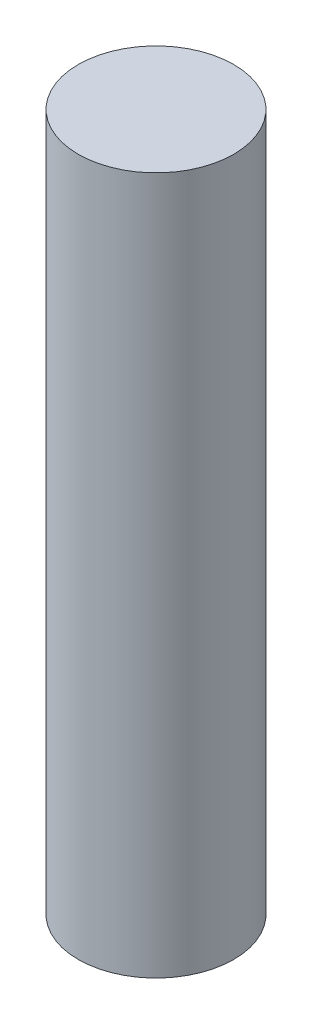
ISO-10303-21;
HEADER;
FILE_DESCRIPTION(('STEP AP214'),'2;1');
FILE_NAME('part.step','',(''),(''),'','','');
FILE_SCHEMA(('AUTOMOTIVE_DESIGN { 1 0 10303 214 1 1 1 1 }'));
ENDSEC;
DATA;
#1=APPLICATION_CONTEXT('core data for automotive mechanical design processes');
#2=APPLICATION_PROTOCOL_DEFINITION('international standard','automotive_design',2000,#1);
#3=PRODUCT_CONTEXT('',#1,'mechanical');
#4=PRODUCT('Part','Part','',(#3));
#5=PRODUCT_RELATED_PRODUCT_CATEGORY('part','',(#4));
#6=PRODUCT_DEFINITION_FORMATION('','',#4);
#7=PRODUCT_DEFINITION_CONTEXT('part definition',#1,'design');
#8=PRODUCT_DEFINITION('design','',#6,#7);
#9=PRODUCT_DEFINITION_SHAPE('','',#8);
#10=(LENGTH_UNIT() NAMED_UNIT(*) SI_UNIT(.MILLI.,.METRE.));
#11=(NAMED_UNIT(*) PLANE_ANGLE_UNIT() SI_UNIT($,.RADIAN.));
#12=(NAMED_UNIT(*) SI_UNIT($,.STERADIAN.) SOLID_ANGLE_UNIT());
#13=UNCERTAINTY_MEASURE_WITH_UNIT(LENGTH_MEASURE(1.E-05),#10,'distance_accuracy_value','');
#14=(GEOMETRIC_REPRESENTATION_CONTEXT(3) GLOBAL_UNCERTAINTY_ASSIGNED_CONTEXT((#13)) GLOBAL_UNIT_ASSIGNED_CONTEXT((#10,
#11,#12)) REPRESENTATION_CONTEXT('',''));
#15=CARTESIAN_POINT('',(0.,0.,0.));
#16=DIRECTION('',(0.,0.,1.));
#17=DIRECTION('',(1.,0.,0.));
#18=AXIS2_PLACEMENT_3D('',#15,#16,#17);
#19=CARTESIAN_POINT('',(0.,5060.,0.));
#20=DIRECTION('',(0.,-1.,0.));
#21=DIRECTION('',(0.,0.,-1.));
#22=AXIS2_PLACEMENT_3D('',#19,#20,#21);
#23=CYLINDRICAL_SURFACE('',#22,564.2);
#24=CARTESIAN_POINT('',(0.,5060.,0.));
#25=DIRECTION('',(0.,1.,0.));
#26=DIRECTION('',(0.,0.,1.));
#27=AXIS2_PLACEMENT_3D('',#24,#25,#26);
#28=CIRCLE('',#27,564.2);
#29=CARTESIAN_POINT('',(0.,5060.,564.2));
#30=VERTEX_POINT('',#29);
#31=EDGE_CURVE('E10',#30,#30,#28,.T.);
#32=ORIENTED_EDGE('',*,*,#31,.F.);
#33=EDGE_LOOP('',(#32));
#34=FACE_BOUND('',#33,.T.);
#35=CARTESIAN_POINT('',(0.,0.,0.));
#36=DIRECTION('',(0.,1.,0.));
#37=DIRECTION('',(0.,0.,1.));
#38=AXIS2_PLACEMENT_3D('',#35,#36,#37);
#39=CIRCLE('',#38,564.2);
#40=CARTESIAN_POINT('',(0.,0.,564.2));
#41=VERTEX_POINT('',#40);
#42=EDGE_CURVE('E44',#41,#41,#39,.T.);
#43=ORIENTED_EDGE('',*,*,#42,.T.);
#44=EDGE_LOOP('',(#43));
#45=FACE_BOUND('',#44,.T.);
#46=ADVANCED_FACE('F41',(#34,#45),#23,.T.);
#47=CARTESIAN_POINT('',(0.,5060.,0.));
#48=DIRECTION('',(0.,1.,0.));
#49=DIRECTION('',(0.,0.,1.));
#50=AXIS2_PLACEMENT_3D('',#47,#48,#49);
#51=PLANE('',#50);
#52=ORIENTED_EDGE('',*,*,#31,.T.);
#53=EDGE_LOOP('',(#52));
#54=FACE_BOUND('',#53,.T.);
#55=ADVANCED_FACE('F56',(#54),#51,.T.);
#56=CARTESIAN_POINT('',(0.,0.,0.));
#57=DIRECTION('',(0.,1.,0.));
#58=DIRECTION('',(0.,0.,1.));
#59=AXIS2_PLACEMENT_3D('',#56,#57,#58);
#60=PLANE('',#59);
#61=ORIENTED_EDGE('',*,*,#42,.F.);
#62=EDGE_LOOP('',(#61));
#63=FACE_BOUND('',#62,.T.);
#64=ADVANCED_FACE('F54',(#63),#60,.F.);
#65=CLOSED_SHELL('',(#46,#55,#64));
#66=MANIFOLD_SOLID_BREP('B2',#65);
#67=ADVANCED_BREP_SHAPE_REPRESENTATION('',(#18,#66),#14);
#68=SHAPE_DEFINITION_REPRESENTATION(#9,#67);
ENDSEC;
END-ISO-10303-21;
